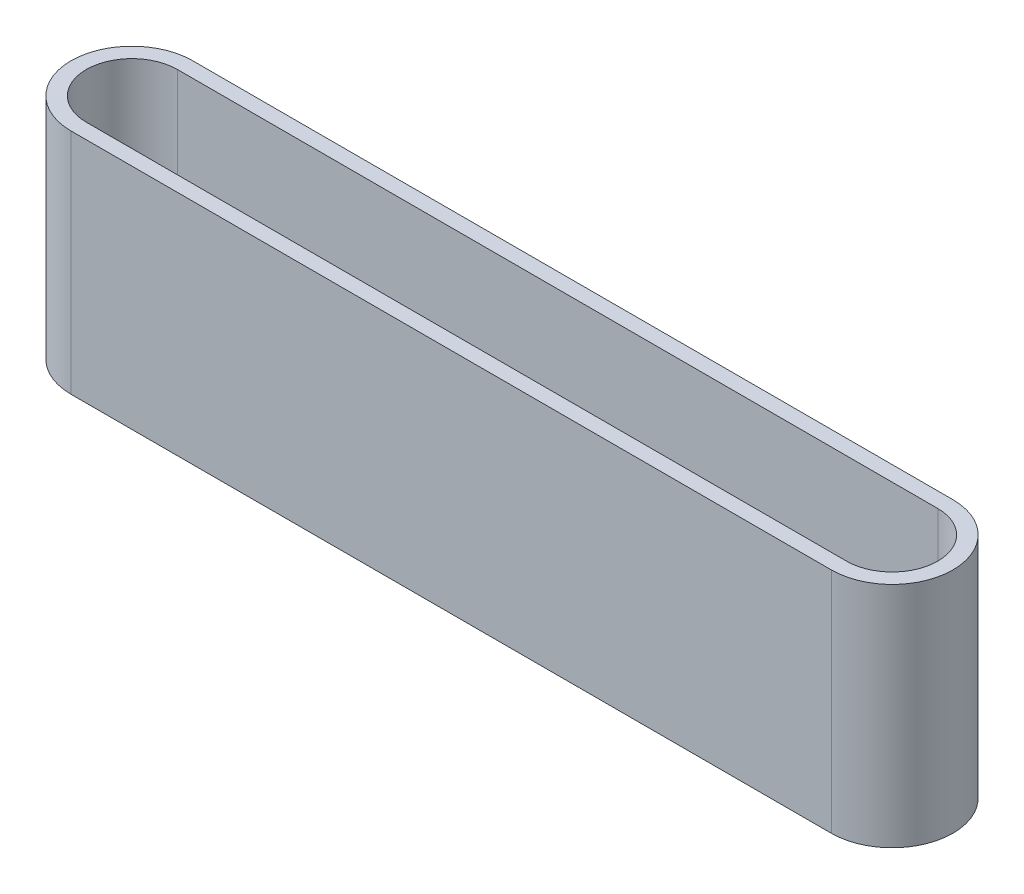
ISO-10303-21;
HEADER;
FILE_DESCRIPTION(('STEP AP214'),'2;1');
FILE_NAME('part.step','',(''),(''),'','','');
FILE_SCHEMA(('AUTOMOTIVE_DESIGN { 1 0 10303 214 1 1 1 1 }'));
ENDSEC;
DATA;
#1=APPLICATION_CONTEXT('core data for automotive mechanical design processes');
#2=APPLICATION_PROTOCOL_DEFINITION('international standard','automotive_design',2000,#1);
#3=PRODUCT_CONTEXT('',#1,'mechanical');
#4=PRODUCT('Part','Part','',(#3));
#5=PRODUCT_RELATED_PRODUCT_CATEGORY('part','',(#4));
#6=PRODUCT_DEFINITION_FORMATION('','',#4);
#7=PRODUCT_DEFINITION_CONTEXT('part definition',#1,'design');
#8=PRODUCT_DEFINITION('design','',#6,#7);
#9=PRODUCT_DEFINITION_SHAPE('','',#8);
#10=(LENGTH_UNIT() NAMED_UNIT(*) SI_UNIT(.MILLI.,.METRE.));
#11=(NAMED_UNIT(*) PLANE_ANGLE_UNIT() SI_UNIT($,.RADIAN.));
#12=(NAMED_UNIT(*) SI_UNIT($,.STERADIAN.) SOLID_ANGLE_UNIT());
#13=UNCERTAINTY_MEASURE_WITH_UNIT(LENGTH_MEASURE(1.E-05),#10,'distance_accuracy_value','');
#14=(GEOMETRIC_REPRESENTATION_CONTEXT(3) GLOBAL_UNCERTAINTY_ASSIGNED_CONTEXT((#13)) GLOBAL_UNIT_ASSIGNED_CONTEXT((#10,
#11,#12)) REPRESENTATION_CONTEXT('',''));
#15=CARTESIAN_POINT('',(0.,0.,0.));
#16=DIRECTION('',(0.,0.,1.));
#17=DIRECTION('',(1.,0.,0.));
#18=AXIS2_PLACEMENT_3D('',#15,#16,#17);
#19=CARTESIAN_POINT('',(0.,150.,0.));
#20=DIRECTION('',(0.,1.,0.));
#21=DIRECTION('',(0.,0.,1.));
#22=AXIS2_PLACEMENT_3D('',#19,#20,#21);
#23=PLANE('',#22);
#24=CARTESIAN_POINT('',(0.,150.,0.));
#25=DIRECTION('',(0.,1.,0.));
#26=DIRECTION('',(0.,0.,1.));
#27=AXIS2_PLACEMENT_3D('',#24,#25,#26);
#28=CIRCLE('',#27,40.);
#29=CARTESIAN_POINT('',(0.,150.,40.));
#30=VERTEX_POINT('',#29);
#31=CARTESIAN_POINT('',(0.,150.,-40.));
#32=VERTEX_POINT('',#31);
#33=EDGE_CURVE('E134',#30,#32,#28,.T.);
#34=ORIENTED_EDGE('',*,*,#33,.T.);
#35=DIRECTION('',(-1.,0.,0.));
#36=VECTOR('',#35,1.);
#37=CARTESIAN_POINT('',(0.,150.,-40.));
#38=LINE('',#37,#36);
#39=CARTESIAN_POINT('',(-500.,150.,-40.));
#40=VERTEX_POINT('',#39);
#41=EDGE_CURVE('E137',#32,#40,#38,.T.);
#42=ORIENTED_EDGE('',*,*,#41,.T.);
#43=CARTESIAN_POINT('',(-500.,150.,0.));
#44=DIRECTION('',(0.,1.,0.));
#45=DIRECTION('',(0.,0.,1.));
#46=AXIS2_PLACEMENT_3D('',#43,#44,#45);
#47=CIRCLE('',#46,40.);
#48=CARTESIAN_POINT('',(-500.,150.,40.0000000000001));
#49=VERTEX_POINT('',#48);
#50=EDGE_CURVE('E140',#40,#49,#47,.T.);
#51=ORIENTED_EDGE('',*,*,#50,.T.);
#52=DIRECTION('',(1.,0.,0.));
#53=VECTOR('',#52,1.);
#54=CARTESIAN_POINT('',(0.,150.,40.));
#55=LINE('',#54,#53);
#56=EDGE_CURVE('E142',#49,#30,#55,.T.);
#57=ORIENTED_EDGE('',*,*,#56,.T.);
#58=EDGE_LOOP('',(#34,#42,#51,#57));
#59=FACE_BOUND('',#58,.T.);
#60=DIRECTION('',(-1.,0.,0.));
#61=VECTOR('',#60,1.);
#62=CARTESIAN_POINT('',(0.,150.,-30.));
#63=LINE('',#62,#61);
#64=CARTESIAN_POINT('',(0.,150.,-30.));
#65=VERTEX_POINT('',#64);
#66=CARTESIAN_POINT('',(-500.,150.,-30.));
#67=VERTEX_POINT('',#66);
#68=EDGE_CURVE('E106',#65,#67,#63,.T.);
#69=ORIENTED_EDGE('',*,*,#68,.F.);
#70=CARTESIAN_POINT('',(0.,150.,0.));
#71=DIRECTION('',(0.,1.,0.));
#72=DIRECTION('',(0.,0.,1.));
#73=AXIS2_PLACEMENT_3D('',#70,#71,#72);
#74=CIRCLE('',#73,30.);
#75=CARTESIAN_POINT('',(0.,150.,30.));
#76=VERTEX_POINT('',#75);
#77=EDGE_CURVE('E98',#76,#65,#74,.T.);
#78=ORIENTED_EDGE('',*,*,#77,.F.);
#79=DIRECTION('',(1.,0.,0.));
#80=VECTOR('',#79,1.);
#81=CARTESIAN_POINT('',(0.,150.,30.));
#82=LINE('',#81,#80);
#83=CARTESIAN_POINT('',(-500.,150.,30.0000000000001));
#84=VERTEX_POINT('',#83);
#85=EDGE_CURVE('E120',#84,#76,#82,.T.);
#86=ORIENTED_EDGE('',*,*,#85,.F.);
#87=CARTESIAN_POINT('',(-500.,150.,0.));
#88=DIRECTION('',(0.,1.,0.));
#89=DIRECTION('',(0.,0.,1.));
#90=AXIS2_PLACEMENT_3D('',#87,#88,#89);
#91=CIRCLE('',#90,30.);
#92=EDGE_CURVE('E118',#67,#84,#91,.T.);
#93=ORIENTED_EDGE('',*,*,#92,.F.);
#94=EDGE_LOOP('',(#69,#78,#86,#93));
#95=FACE_BOUND('',#94,.T.);
#96=ADVANCED_FACE('F33',(#59,#95),#23,.T.);
#97=CARTESIAN_POINT('',(0.,0.,0.));
#98=DIRECTION('',(0.,1.,0.));
#99=DIRECTION('',(0.,0.,1.));
#100=AXIS2_PLACEMENT_3D('',#97,#98,#99);
#101=PLANE('',#100);
#102=CARTESIAN_POINT('',(0.,0.,0.));
#103=DIRECTION('',(0.,1.,0.));
#104=DIRECTION('',(0.,0.,1.));
#105=AXIS2_PLACEMENT_3D('',#102,#103,#104);
#106=CIRCLE('',#105,40.);
#107=CARTESIAN_POINT('',(0.,0.,40.));
#108=VERTEX_POINT('',#107);
#109=CARTESIAN_POINT('',(0.,0.,-40.));
#110=VERTEX_POINT('',#109);
#111=EDGE_CURVE('E114',#108,#110,#106,.T.);
#112=ORIENTED_EDGE('',*,*,#111,.F.);
#113=DIRECTION('',(1.,0.,0.));
#114=VECTOR('',#113,1.);
#115=CARTESIAN_POINT('',(0.,0.,40.));
#116=LINE('',#115,#114);
#117=CARTESIAN_POINT('',(-500.,0.,40.0000000000001));
#118=VERTEX_POINT('',#117);
#119=EDGE_CURVE('E138',#118,#108,#116,.T.);
#120=ORIENTED_EDGE('',*,*,#119,.F.);
#121=CARTESIAN_POINT('',(-500.,0.,0.));
#122=DIRECTION('',(0.,1.,0.));
#123=DIRECTION('',(0.,0.,1.));
#124=AXIS2_PLACEMENT_3D('',#121,#122,#123);
#125=CIRCLE('',#124,40.);
#126=CARTESIAN_POINT('',(-500.,0.,-40.));
#127=VERTEX_POINT('',#126);
#128=EDGE_CURVE('E149',#127,#118,#125,.T.);
#129=ORIENTED_EDGE('',*,*,#128,.F.);
#130=DIRECTION('',(-1.,0.,0.));
#131=VECTOR('',#130,1.);
#132=CARTESIAN_POINT('',(0.,0.,-40.));
#133=LINE('',#132,#131);
#134=EDGE_CURVE('E147',#110,#127,#133,.T.);
#135=ORIENTED_EDGE('',*,*,#134,.F.);
#136=EDGE_LOOP('',(#112,#120,#129,#135));
#137=FACE_BOUND('',#136,.T.);
#138=CARTESIAN_POINT('',(0.,0.,0.));
#139=DIRECTION('',(0.,1.,0.));
#140=DIRECTION('',(0.,0.,1.));
#141=AXIS2_PLACEMENT_3D('',#138,#139,#140);
#142=CIRCLE('',#141,30.);
#143=CARTESIAN_POINT('',(0.,0.,30.));
#144=VERTEX_POINT('',#143);
#145=CARTESIAN_POINT('',(0.,0.,-30.));
#146=VERTEX_POINT('',#145);
#147=EDGE_CURVE('E56',#144,#146,#142,.T.);
#148=ORIENTED_EDGE('',*,*,#147,.T.);
#149=DIRECTION('',(-1.,0.,0.));
#150=VECTOR('',#149,1.);
#151=CARTESIAN_POINT('',(0.,0.,-30.));
#152=LINE('',#151,#150);
#153=CARTESIAN_POINT('',(-500.,0.,-30.));
#154=VERTEX_POINT('',#153);
#155=EDGE_CURVE('E113',#146,#154,#152,.T.);
#156=ORIENTED_EDGE('',*,*,#155,.T.);
#157=CARTESIAN_POINT('',(-500.,0.,0.));
#158=DIRECTION('',(0.,1.,0.));
#159=DIRECTION('',(0.,0.,1.));
#160=AXIS2_PLACEMENT_3D('',#157,#158,#159);
#161=CIRCLE('',#160,30.);
#162=CARTESIAN_POINT('',(-500.,0.,30.0000000000001));
#163=VERTEX_POINT('',#162);
#164=EDGE_CURVE('E126',#154,#163,#161,.T.);
#165=ORIENTED_EDGE('',*,*,#164,.T.);
#166=DIRECTION('',(1.,0.,0.));
#167=VECTOR('',#166,1.);
#168=CARTESIAN_POINT('',(0.,0.,30.));
#169=LINE('',#168,#167);
#170=EDGE_CURVE('E107',#163,#144,#169,.T.);
#171=ORIENTED_EDGE('',*,*,#170,.T.);
#172=EDGE_LOOP('',(#148,#156,#165,#171));
#173=FACE_BOUND('',#172,.T.);
#174=ADVANCED_FACE('F167',(#137,#173),#101,.F.);
#175=CARTESIAN_POINT('',(0.,150.,0.));
#176=DIRECTION('',(0.,-1.,0.));
#177=DIRECTION('',(0.,0.,-1.));
#178=AXIS2_PLACEMENT_3D('',#175,#176,#177);
#179=CYLINDRICAL_SURFACE('',#178,40.);
#180=ORIENTED_EDGE('',*,*,#111,.T.);
#181=DIRECTION('',(0.,-1.,0.));
#182=VECTOR('',#181,1.);
#183=CARTESIAN_POINT('',(0.,150.,-40.));
#184=LINE('',#183,#182);
#185=EDGE_CURVE('E11',#32,#110,#184,.T.);
#186=ORIENTED_EDGE('',*,*,#185,.F.);
#187=ORIENTED_EDGE('',*,*,#33,.F.);
#188=DIRECTION('',(0.,-1.,0.));
#189=VECTOR('',#188,1.);
#190=CARTESIAN_POINT('',(0.,150.,40.));
#191=LINE('',#190,#189);
#192=EDGE_CURVE('E144',#30,#108,#191,.T.);
#193=ORIENTED_EDGE('',*,*,#192,.T.);
#194=EDGE_LOOP('',(#180,#186,#187,#193));
#195=FACE_BOUND('',#194,.T.);
#196=ADVANCED_FACE('F35',(#195),#179,.T.);
#197=CARTESIAN_POINT('',(0.,150.,-40.));
#198=DIRECTION('',(0.,0.,1.));
#199=DIRECTION('',(1.,0.,0.));
#200=AXIS2_PLACEMENT_3D('',#197,#198,#199);
#201=PLANE('',#200);
#202=ORIENTED_EDGE('',*,*,#134,.T.);
#203=DIRECTION('',(0.,-1.,0.));
#204=VECTOR('',#203,1.);
#205=CARTESIAN_POINT('',(-500.,150.,-40.));
#206=LINE('',#205,#204);
#207=EDGE_CURVE('E41',#40,#127,#206,.T.);
#208=ORIENTED_EDGE('',*,*,#207,.F.);
#209=ORIENTED_EDGE('',*,*,#41,.F.);
#210=ORIENTED_EDGE('',*,*,#185,.T.);
#211=EDGE_LOOP('',(#202,#208,#209,#210));
#212=FACE_BOUND('',#211,.T.);
#213=ADVANCED_FACE('F177',(#212),#201,.F.);
#214=CARTESIAN_POINT('',(-500.,150.,0.));
#215=DIRECTION('',(0.,-1.,0.));
#216=DIRECTION('',(0.,0.,-1.));
#217=AXIS2_PLACEMENT_3D('',#214,#215,#216);
#218=CYLINDRICAL_SURFACE('',#217,40.);
#219=ORIENTED_EDGE('',*,*,#128,.T.);
#220=DIRECTION('',(0.,-1.,0.));
#221=VECTOR('',#220,1.);
#222=CARTESIAN_POINT('',(-500.,150.,40.0000000000001));
#223=LINE('',#222,#221);
#224=EDGE_CURVE('E154',#49,#118,#223,.T.);
#225=ORIENTED_EDGE('',*,*,#224,.F.);
#226=ORIENTED_EDGE('',*,*,#50,.F.);
#227=ORIENTED_EDGE('',*,*,#207,.T.);
#228=EDGE_LOOP('',(#219,#225,#226,#227));
#229=FACE_BOUND('',#228,.T.);
#230=ADVANCED_FACE('F161',(#229),#218,.T.);
#231=CARTESIAN_POINT('',(0.,150.,40.));
#232=DIRECTION('',(0.,0.,-1.));
#233=DIRECTION('',(-1.,0.,0.));
#234=AXIS2_PLACEMENT_3D('',#231,#232,#233);
#235=PLANE('',#234);
#236=ORIENTED_EDGE('',*,*,#119,.T.);
#237=ORIENTED_EDGE('',*,*,#192,.F.);
#238=ORIENTED_EDGE('',*,*,#56,.F.);
#239=ORIENTED_EDGE('',*,*,#224,.T.);
#240=EDGE_LOOP('',(#236,#237,#238,#239));
#241=FACE_BOUND('',#240,.T.);
#242=ADVANCED_FACE('F171',(#241),#235,.F.);
#243=CARTESIAN_POINT('',(0.,150.,0.));
#244=DIRECTION('',(0.,-1.,0.));
#245=DIRECTION('',(0.,0.,-1.));
#246=AXIS2_PLACEMENT_3D('',#243,#244,#245);
#247=CYLINDRICAL_SURFACE('',#246,30.);
#248=ORIENTED_EDGE('',*,*,#147,.F.);
#249=DIRECTION('',(0.,-1.,0.));
#250=VECTOR('',#249,1.);
#251=CARTESIAN_POINT('',(0.,150.,30.));
#252=LINE('',#251,#250);
#253=EDGE_CURVE('E102',#76,#144,#252,.T.);
#254=ORIENTED_EDGE('',*,*,#253,.F.);
#255=ORIENTED_EDGE('',*,*,#77,.T.);
#256=DIRECTION('',(0.,-1.,0.));
#257=VECTOR('',#256,1.);
#258=CARTESIAN_POINT('',(0.,150.,-30.));
#259=LINE('',#258,#257);
#260=EDGE_CURVE('E101',#65,#146,#259,.T.);
#261=ORIENTED_EDGE('',*,*,#260,.T.);
#262=EDGE_LOOP('',(#248,#254,#255,#261));
#263=FACE_BOUND('',#262,.T.);
#264=ADVANCED_FACE('F100',(#263),#247,.F.);
#265=CARTESIAN_POINT('',(0.,150.,-30.));
#266=DIRECTION('',(0.,0.,1.));
#267=DIRECTION('',(1.,0.,0.));
#268=AXIS2_PLACEMENT_3D('',#265,#266,#267);
#269=PLANE('',#268);
#270=ORIENTED_EDGE('',*,*,#155,.F.);
#271=ORIENTED_EDGE('',*,*,#260,.F.);
#272=ORIENTED_EDGE('',*,*,#68,.T.);
#273=DIRECTION('',(0.,-1.,0.));
#274=VECTOR('',#273,1.);
#275=CARTESIAN_POINT('',(-500.,150.,-30.));
#276=LINE('',#275,#274);
#277=EDGE_CURVE('E115',#67,#154,#276,.T.);
#278=ORIENTED_EDGE('',*,*,#277,.T.);
#279=EDGE_LOOP('',(#270,#271,#272,#278));
#280=FACE_BOUND('',#279,.T.);
#281=ADVANCED_FACE('F110',(#280),#269,.T.);
#282=CARTESIAN_POINT('',(-500.,150.,0.));
#283=DIRECTION('',(0.,-1.,0.));
#284=DIRECTION('',(0.,0.,-1.));
#285=AXIS2_PLACEMENT_3D('',#282,#283,#284);
#286=CYLINDRICAL_SURFACE('',#285,30.);
#287=ORIENTED_EDGE('',*,*,#164,.F.);
#288=ORIENTED_EDGE('',*,*,#277,.F.);
#289=ORIENTED_EDGE('',*,*,#92,.T.);
#290=DIRECTION('',(0.,-1.,0.));
#291=VECTOR('',#290,1.);
#292=CARTESIAN_POINT('',(-500.,150.,30.0000000000001));
#293=LINE('',#292,#291);
#294=EDGE_CURVE('E48',#84,#163,#293,.T.);
#295=ORIENTED_EDGE('',*,*,#294,.T.);
#296=EDGE_LOOP('',(#287,#288,#289,#295));
#297=FACE_BOUND('',#296,.T.);
#298=ADVANCED_FACE('F200',(#297),#286,.F.);
#299=CARTESIAN_POINT('',(0.,150.,30.));
#300=DIRECTION('',(0.,0.,-1.));
#301=DIRECTION('',(-1.,0.,0.));
#302=AXIS2_PLACEMENT_3D('',#299,#300,#301);
#303=PLANE('',#302);
#304=ORIENTED_EDGE('',*,*,#170,.F.);
#305=ORIENTED_EDGE('',*,*,#294,.F.);
#306=ORIENTED_EDGE('',*,*,#85,.T.);
#307=ORIENTED_EDGE('',*,*,#253,.T.);
#308=EDGE_LOOP('',(#304,#305,#306,#307));
#309=FACE_BOUND('',#308,.T.);
#310=ADVANCED_FACE('F204',(#309),#303,.T.);
#311=CLOSED_SHELL('',(#96,#174,#196,#213,#230,#242,#264,#281,#298,#310));
#312=MANIFOLD_SOLID_BREP('B2',#311);
#313=ADVANCED_BREP_SHAPE_REPRESENTATION('',(#18,#312),#14);
#314=SHAPE_DEFINITION_REPRESENTATION(#9,#313);
ENDSEC;
END-ISO-10303-21;
